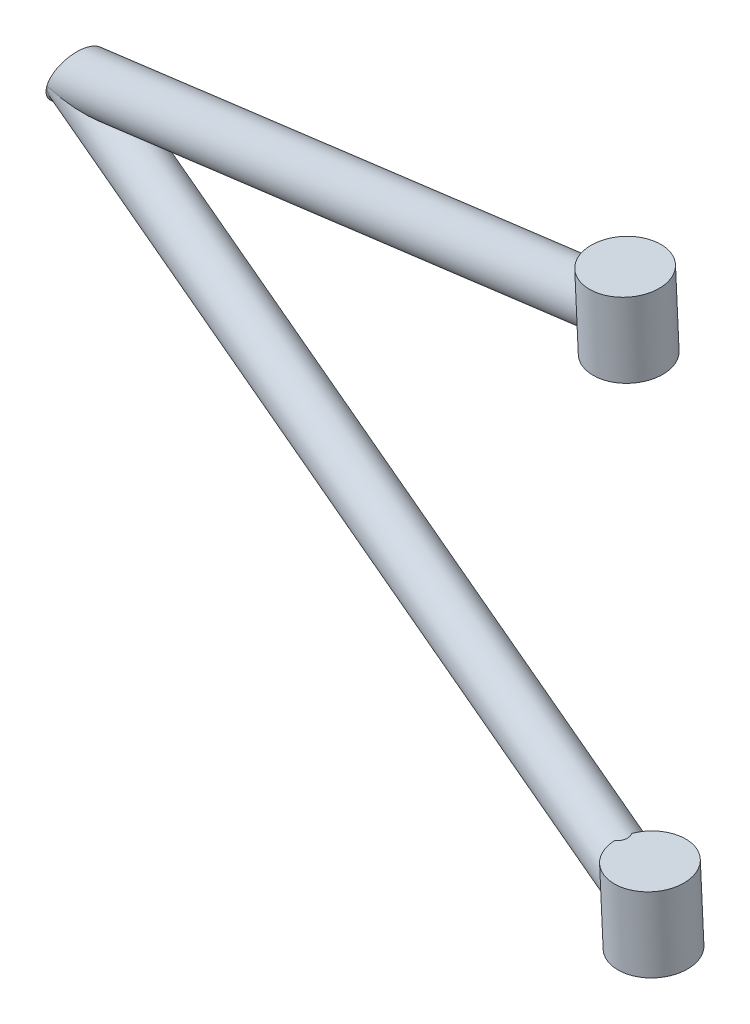
ISO-10303-21;
HEADER;
FILE_DESCRIPTION(('STEP AP214'),'2;1');
FILE_NAME('part.step','',(''),(''),'','','');
FILE_SCHEMA(('AUTOMOTIVE_DESIGN { 1 0 10303 214 1 1 1 1 }'));
ENDSEC;
DATA;
#1=APPLICATION_CONTEXT('core data for automotive mechanical design processes');
#2=APPLICATION_PROTOCOL_DEFINITION('international standard','automotive_design',2000,#1);
#3=PRODUCT_CONTEXT('',#1,'mechanical');
#4=PRODUCT('Part','Part','',(#3));
#5=PRODUCT_RELATED_PRODUCT_CATEGORY('part','',(#4));
#6=PRODUCT_DEFINITION_FORMATION('','',#4);
#7=PRODUCT_DEFINITION_CONTEXT('part definition',#1,'design');
#8=PRODUCT_DEFINITION('design','',#6,#7);
#9=PRODUCT_DEFINITION_SHAPE('','',#8);
#10=(LENGTH_UNIT() NAMED_UNIT(*) SI_UNIT(.MILLI.,.METRE.));
#11=(NAMED_UNIT(*) PLANE_ANGLE_UNIT() SI_UNIT($,.RADIAN.));
#12=(NAMED_UNIT(*) SI_UNIT($,.STERADIAN.) SOLID_ANGLE_UNIT());
#13=UNCERTAINTY_MEASURE_WITH_UNIT(LENGTH_MEASURE(1.E-05),#10,'distance_accuracy_value','');
#14=(GEOMETRIC_REPRESENTATION_CONTEXT(3) GLOBAL_UNCERTAINTY_ASSIGNED_CONTEXT((#13)) GLOBAL_UNIT_ASSIGNED_CONTEXT((#10,
#11,#12)) REPRESENTATION_CONTEXT('',''));
#15=CARTESIAN_POINT('',(0.,0.,0.));
#16=DIRECTION('',(0.,0.,1.));
#17=DIRECTION('',(1.,0.,0.));
#18=AXIS2_PLACEMENT_3D('',#15,#16,#17);
#19=CARTESIAN_POINT('',(-255.,-221.47,-254.503));
#20=DIRECTION('',(-0.912524270681738,0.366844617908996,-0.18089909266761));
#21=DIRECTION('',(-0.372998472957095,-0.927831956321658,0.));
#22=AXIS2_PLACEMENT_3D('',#19,#20,#21);
#23=CYLINDRICAL_SURFACE('',#22,9.525);
#24=CARTESIAN_POINT('',(-293.242179047782,-206.096230762816,-262.084141360994));
#25=DIRECTION('',(0.,0.998892249777093,0.0470560658710238));
#26=DIRECTION('',(-0.977268280554209,0.00997618647777122,-0.211771536156257));
#27=AXIS2_PLACEMENT_3D('',#24,#25,#26);
#28=ELLIPSE('',#27,26.6116574264944,9.525);
#29=CARTESIAN_POINT('',(-267.803485256219,-206.220132528784,-259.453991316177));
#30=VERTEX_POINT('',#29);
#31=CARTESIAN_POINT('',(-268.999181284131,-206.479491491884,-253.948395951266));
#32=VERTEX_POINT('',#31);
#33=EDGE_CURVE('E80',#30,#32,#28,.F.);
#34=ORIENTED_EDGE('',*,*,#33,.F.);
#35=CARTESIAN_POINT('',(-268.999181284131,-206.479491491884,-253.948395951266));
#36=CARTESIAN_POINT('',(-269.002027058384,-206.597281765921,-253.691307271021));
#37=CARTESIAN_POINT('',(-268.997422440891,-206.727582274235,-253.440362789745));
#38=CARTESIAN_POINT('',(-268.975269621373,-207.009720352981,-252.952253153281));
#39=CARTESIAN_POINT('',(-268.957753102969,-207.161504470911,-252.715055799051));
#40=CARTESIAN_POINT('',(-268.889261389808,-207.641032528117,-252.029920876135));
#41=CARTESIAN_POINT('',(-268.822316578556,-207.995888817091,-251.60233013466));
#42=CARTESIAN_POINT('',(-268.688358795682,-208.624830076123,-250.944160886033));
#43=CARTESIAN_POINT('',(-268.62951435236,-208.883915213699,-250.696886145662));
#44=CARTESIAN_POINT('',(-268.503196462785,-209.420986234165,-250.226017282439));
#45=CARTESIAN_POINT('',(-268.43572174143,-209.698974907154,-250.002426667797));
#46=CARTESIAN_POINT('',(-268.29493645003,-210.272917150471,-249.577361204792));
#47=CARTESIAN_POINT('',(-268.221589231369,-210.568980272668,-249.376047516785));
#48=CARTESIAN_POINT('',(-268.072647655781,-211.17537209919,-248.997219916914));
#49=CARTESIAN_POINT('',(-267.997053459267,-211.485699786018,-248.819704311051));
#50=CARTESIAN_POINT('',(-267.844893975632,-212.12747752915,-248.484567080196));
#51=CARTESIAN_POINT('',(-267.768354608773,-212.459267098073,-248.327583357675));
#52=CARTESIAN_POINT('',(-267.620051455921,-213.135360364199,-248.040212795102));
#53=CARTESIAN_POINT('',(-267.548288919906,-213.479667300725,-247.909832898311));
#54=CARTESIAN_POINT('',(-267.414077423232,-214.178139020874,-247.678325051182));
#55=CARTESIAN_POINT('',(-267.351590313371,-214.532255891144,-247.57707557895));
#56=CARTESIAN_POINT('',(-267.240372746688,-215.250128755127,-247.406364494216));
#57=CARTESIAN_POINT('',(-267.191631653116,-215.613877056226,-247.336878277124));
#58=CARTESIAN_POINT('',(-267.128646930773,-216.202946113072,-247.254400520731));
#59=CARTESIAN_POINT('',(-267.108385534404,-216.426048270673,-247.229933694902));
#60=CARTESIAN_POINT('',(-267.075911394003,-216.87391721482,-247.195311467648));
#61=CARTESIAN_POINT('',(-267.06369587303,-217.098683399934,-247.185151127128));
#62=CARTESIAN_POINT('',(-267.048335265385,-217.548471357907,-247.180289769268));
#63=CARTESIAN_POINT('',(-267.045179978434,-217.773492557791,-247.185571353417));
#64=CARTESIAN_POINT('',(-267.048669782723,-218.222500758791,-247.212623151361));
#65=CARTESIAN_POINT('',(-267.055314865061,-218.446487760847,-247.234393350179));
#66=CARTESIAN_POINT('',(-267.07884807896,-218.89338863569,-247.295495765692));
#67=CARTESIAN_POINT('',(-267.095818628274,-219.116279173646,-247.334968611185));
#68=CARTESIAN_POINT('',(-267.139872563679,-219.557090389539,-247.43195988936));
#69=CARTESIAN_POINT('',(-267.166955858159,-219.775011112481,-247.489478158567));
#70=CARTESIAN_POINT('',(-267.230439868918,-220.203962580154,-247.622543216837));
#71=CARTESIAN_POINT('',(-267.266843940386,-220.414990812895,-247.698096497276));
#72=CARTESIAN_POINT('',(-267.347618196681,-220.828334862453,-247.866705483164));
#73=CARTESIAN_POINT('',(-267.391988259384,-221.030650812776,-247.959760920293));
#74=CARTESIAN_POINT('',(-267.482448071842,-221.406482385751,-248.152846530102));
#75=CARTESIAN_POINT('',(-267.52797501819,-221.58090909257,-248.251376723042));
#76=CARTESIAN_POINT('',(-267.622725218573,-221.920901834783,-248.461253315904));
#77=CARTESIAN_POINT('',(-267.671949904864,-222.08646439383,-248.572604690881));
#78=CARTESIAN_POINT('',(-267.772625085065,-222.408216030898,-248.807202572484));
#79=CARTESIAN_POINT('',(-267.824075740608,-222.564404426262,-248.930449943712));
#80=CARTESIAN_POINT('',(-267.92778809184,-222.867161476253,-249.187939081873));
#81=CARTESIAN_POINT('',(-267.980049886566,-223.013728944601,-249.322182200032));
#82=CARTESIAN_POINT('',(-268.090626098118,-223.315039188903,-249.618405103689));
#83=CARTESIAN_POINT('',(-268.148869953667,-223.468471088136,-249.781745462371));
#84=CARTESIAN_POINT('',(-268.26293755966,-223.762892515341,-250.120060600185));
#85=CARTESIAN_POINT('',(-268.318761173744,-223.903881342714,-250.295036033453));
#86=CARTESIAN_POINT('',(-268.426437244984,-224.173461604852,-250.655577583678));
#87=CARTESIAN_POINT('',(-268.478287813328,-224.302047150452,-250.841148665605));
#88=CARTESIAN_POINT('',(-268.576576625746,-224.546723872333,-251.221722458414));
#89=CARTESIAN_POINT('',(-268.623014592875,-224.662814409261,-251.416725651183));
#90=CARTESIAN_POINT('',(-268.715936080794,-224.899573758123,-251.846170310311));
#91=CARTESIAN_POINT('',(-268.761298399741,-225.018135558351,-252.08202122415));
#92=CARTESIAN_POINT('',(-268.841388950985,-225.238341375559,-252.563257168879));
#93=CARTESIAN_POINT('',(-268.876116183664,-225.339983801835,-252.808643093547));
#94=CARTESIAN_POINT('',(-268.933471832033,-225.526134215741,-253.307247811301));
#95=CARTESIAN_POINT('',(-268.956098893357,-225.610640284651,-253.560467477859));
#96=CARTESIAN_POINT('',(-268.988030876522,-225.762237912657,-254.072890173458));
#97=CARTESIAN_POINT('',(-268.997336169749,-225.829329957184,-254.332093035493));
#98=CARTESIAN_POINT('',(-269.001696195754,-225.94639578002,-254.857091203281));
#99=CARTESIAN_POINT('',(-268.99661269584,-225.996198312909,-255.12292597175));
#100=CARTESIAN_POINT('',(-268.971216810513,-226.077536134189,-255.656668183566));
#101=CARTESIAN_POINT('',(-268.950904167836,-226.10907111397,-255.924575661851));
#102=CARTESIAN_POINT('',(-268.894702054331,-226.153693843135,-256.460220538388));
#103=CARTESIAN_POINT('',(-268.858817053428,-226.166786881558,-256.727957963383));
#104=CARTESIAN_POINT('',(-268.771456882729,-226.174472376756,-257.261139869286));
#105=CARTESIAN_POINT('',(-268.719982447356,-226.169065704933,-257.526584457605));
#106=CARTESIAN_POINT('',(-268.604829880745,-226.140562959445,-258.03943952601));
#107=CARTESIAN_POINT('',(-268.541917590735,-226.118393092558,-258.287074296626));
#108=CARTESIAN_POINT('',(-268.402942999876,-226.057612926214,-258.776559617301));
#109=CARTESIAN_POINT('',(-268.326881183952,-226.019003232942,-259.018410380288));
#110=CARTESIAN_POINT('',(-268.162438729957,-225.925587741907,-259.494654410705));
#111=CARTESIAN_POINT('',(-268.074058974807,-225.870783104644,-259.729048211155));
#112=CARTESIAN_POINT('',(-267.886036112298,-225.745288532338,-260.188891402374));
#113=CARTESIAN_POINT('',(-267.786392837061,-225.674598360513,-260.414340659761));
#114=CARTESIAN_POINT('',(-267.577265524763,-225.517804312336,-260.854633062445));
#115=CARTESIAN_POINT('',(-267.467795988483,-225.431722968676,-261.069491134385));
#116=CARTESIAN_POINT('',(-267.240339953389,-225.244446445466,-261.487798245459));
#117=CARTESIAN_POINT('',(-267.122353482928,-225.143251316232,-261.691247322572));
#118=CARTESIAN_POINT('',(-266.879411611677,-224.926041035129,-262.085859224807));
#119=CARTESIAN_POINT('',(-266.754452677016,-224.810018329012,-262.277015712043));
#120=CARTESIAN_POINT('',(-266.499391649497,-224.563497492675,-262.646106065254));
#121=CARTESIAN_POINT('',(-266.36928940199,-224.432998926981,-262.824039533174));
#122=CARTESIAN_POINT('',(-266.098961313591,-224.150540778938,-263.174963078257));
#123=CARTESIAN_POINT('',(-265.958562526261,-223.997814294263,-263.347203546462));
#124=CARTESIAN_POINT('',(-265.676684118047,-223.676783878469,-263.675574987865));
#125=CARTESIAN_POINT('',(-265.535204397941,-223.50847850117,-263.831704462639));
#126=CARTESIAN_POINT('',(-265.253968568908,-223.156491938778,-264.127179552213));
#127=CARTESIAN_POINT('',(-265.114212013242,-222.972814839329,-264.266529602946));
#128=CARTESIAN_POINT('',(-264.839468791914,-222.590210723141,-264.527901074147));
#129=CARTESIAN_POINT('',(-264.704481185994,-222.391286737306,-264.64992592498));
#130=CARTESIAN_POINT('',(-264.465526816704,-222.014497597785,-264.856377119861));
#131=CARTESIAN_POINT('',(-264.360256757068,-221.839013262592,-264.943648891374));
#132=CARTESIAN_POINT('',(-264.15736231258,-221.478165617132,-265.105738541364));
#133=CARTESIAN_POINT('',(-264.059736426078,-221.292804259229,-265.180558869117));
#134=CARTESIAN_POINT('',(-263.87437408173,-220.912964656416,-265.317435442801));
#135=CARTESIAN_POINT('',(-263.786625020899,-220.718498488797,-265.379508040432));
#136=CARTESIAN_POINT('',(-263.622959842622,-220.321083942582,-265.490863218166));
#137=CARTESIAN_POINT('',(-263.547043628743,-220.118135633129,-265.540145902504));
#138=CARTESIAN_POINT('',(-263.408528506179,-219.703835100483,-265.626152331143));
#139=CARTESIAN_POINT('',(-263.346005830121,-219.492442494194,-265.66280487087));
#140=CARTESIAN_POINT('',(-263.236277272517,-219.063930408956,-265.723356887658));
#141=CARTESIAN_POINT('',(-263.189071147856,-218.846811020966,-265.747256567144));
#142=CARTESIAN_POINT('',(-263.110806255877,-218.408655289587,-265.782712991704));
#143=CARTESIAN_POINT('',(-263.079750555972,-218.187618210356,-265.794267392505));
#144=CARTESIAN_POINT('',(-263.033931879105,-217.743582097351,-265.805627749328));
#145=CARTESIAN_POINT('',(-263.019168968806,-217.520583055553,-265.805433657279));
#146=CARTESIAN_POINT('',(-263.005950265585,-217.09206286448,-265.794481668705));
#147=CARTESIAN_POINT('',(-263.006297165886,-216.886554199515,-265.784560418599));
#148=CARTESIAN_POINT('',(-263.019551067483,-216.476526079242,-265.755980641297));
#149=CARTESIAN_POINT('',(-263.032462596494,-216.272007007239,-265.73731896571));
#150=CARTESIAN_POINT('',(-263.088547514609,-215.661416759414,-265.669099951292));
#151=CARTESIAN_POINT('',(-263.149068592571,-215.258189329703,-265.60730481187));
#152=CARTESIAN_POINT('',(-263.29428176386,-214.529335213786,-265.467348013958));
#153=CARTESIAN_POINT('',(-263.373483705904,-214.201702737599,-265.393447957483));
#154=CARTESIAN_POINT('',(-263.55279965705,-213.556926237932,-265.226848595537));
#155=CARTESIAN_POINT('',(-263.652926045861,-213.239788552819,-265.134138162074));
#156=CARTESIAN_POINT('',(-263.87007950305,-212.616032874436,-264.930329061104));
#157=CARTESIAN_POINT('',(-263.987169701014,-212.309459718312,-264.819161470459));
#158=CARTESIAN_POINT('',(-264.234236617331,-211.708892677373,-264.578879055059));
#159=CARTESIAN_POINT('',(-264.36421128217,-211.414896798661,-264.449767088948));
#160=CARTESIAN_POINT('',(-264.639599156271,-210.82826385451,-264.167489929058));
#161=CARTESIAN_POINT('',(-264.785430839137,-210.536198629456,-264.01354420514));
#162=CARTESIAN_POINT('',(-265.084676500241,-209.967913709799,-263.685033927689));
#163=CARTESIAN_POINT('',(-265.238091130409,-209.69169538203,-263.510467599541));
#164=CARTESIAN_POINT('',(-265.548743946872,-209.158633919375,-263.140711175994));
#165=CARTESIAN_POINT('',(-265.705953948938,-208.901685272908,-262.945649983384));
#166=CARTESIAN_POINT('',(-266.022310306382,-208.407975201705,-262.532730629854));
#167=CARTESIAN_POINT('',(-266.181456512893,-208.171212236041,-262.314874211901));
#168=CARTESIAN_POINT('',(-266.467977558257,-207.764983283899,-261.899536373176));
#169=CARTESIAN_POINT('',(-266.595545250988,-207.591357100887,-261.706261089943));
#170=CARTESIAN_POINT('',(-266.848091703795,-207.262105549216,-261.303602764138));
#171=CARTESIAN_POINT('',(-266.973072456049,-207.106465871146,-261.094232749884));
#172=CARTESIAN_POINT('',(-267.219910845411,-206.814249037155,-260.656435079789));
#173=CARTESIAN_POINT('',(-267.341716293618,-206.677910717974,-260.427816558191));
#174=CARTESIAN_POINT('',(-267.578479687007,-206.429643838718,-259.953499126584));
#175=CARTESIAN_POINT('',(-267.693418672708,-206.317780781797,-259.707756647516));
#176=CARTESIAN_POINT('',(-267.803485256219,-206.220132528784,-259.453991316177));
#177=B_SPLINE_CURVE_WITH_KNOTS('',3,(#35,#36,#37,#38,#39,#40,#41,#42,#43,#44,#45,#46,#47,#48,
#49,#50,#51,#52,#53,#54,#55,#56,#57,#58,#59,#60,#61,#62,#63,#64,#65,#66,#67,#68,#69,#70,#71,#72,
#73,#74,#75,#76,#77,#78,#79,#80,#81,#82,#83,#84,#85,#86,#87,#88,#89,#90,#91,#92,#93,#94,#95,#96,
#97,#98,#99,#100,#101,#102,#103,#104,#105,#106,#107,#108,#109,#110,#111,#112,#113,#114,#115,
#116,#117,#118,#119,#120,#121,#122,#123,#124,#125,#126,#127,#128,#129,#130,#131,#132,#133,#134,
#135,#136,#137,#138,#139,#140,#141,#142,#143,#144,#145,#146,#147,#148,#149,#150,#151,#152,#153,
#154,#155,#156,#157,#158,#159,#160,#161,#162,#163,#164,#165,#166,#167,#168,#169,#170,#171,#172,
#173,#174,#175,#176),.UNSPECIFIED.,.F.,.F.,(4,2,2,2,2,2,2,2,2,2,2,2,2,2,2,2,2,2,2,2,2,2,2,2,2,2,
2,2,2,2,2,2,2,2,2,2,2,2,2,2,2,2,2,2,2,2,2,2,2,2,2,2,2,2,2,2,2,2,2,2,2,2,2,2,2,2,2,2,2,2,4),(0.,
0.847248957157231,1.6924258005278,3.36276576404507,4.45048572585774,5.53836658145462,
6.63366380567451,7.72888302282516,8.8526026956397,9.97661527103461,11.0958685200097,
12.2142532928548,12.8897999019044,13.5651132316115,14.2396659749774,14.9142181056372,
15.5942264573468,16.2742286490016,16.9544759652559,17.6347128537402,18.2503947330978,
18.866316328309,19.4822827225455,20.0983249244539,20.7922888745158,21.4862918728685,
22.1806227833062,22.8749892047903,23.677589920424,24.4802660513894,25.2830320066975,
26.0857755818622,26.8962571907383,27.7067524913824,28.5170152994147,29.3272399417495,
30.0956997057351,30.8641311366938,31.6325075166233,32.4008953503882,33.1681673395534,
33.9354367744217,34.7030986823458,35.4707836899616,36.278760846051,37.0868130815582,
37.8946512231761,38.702329190311,39.3690957519279,40.0357310011374,40.701505731846,
41.3672750364111,42.0367385694379,42.7061914757576,43.3757714834112,44.0453542307181,
44.6619834053255,45.2788348670848,46.5121712393652,47.5460979811353,48.5806381743947,
49.6191322393971,50.6574610554911,51.7392464537713,52.8211250187362,53.8965658681629,
54.9719245473777,55.8393415741105,56.7060636942318,57.5827161452229,58.4616868366876),.UNSPECIFIED.);
#178=EDGE_CURVE('E86',#32,#30,#177,.T.);
#179=ORIENTED_EDGE('',*,*,#178,.F.);
#180=EDGE_LOOP('',(#34,#179));
#181=FACE_BOUND('',#180,.T.);
#182=CARTESIAN_POINT('',(-536.966082,-108.116588,-310.400043));
#183=DIRECTION('',(-0.977042799081254,0.0314302037809526,-0.210711914835768));
#184=DIRECTION('',(0.0209918277884314,0.998447490299481,0.0515941109116967));
#185=AXIS2_PLACEMENT_3D('',#182,#183,#184);
#186=ELLIPSE('',#185,10.1198136751925,9.525);
#187=CARTESIAN_POINT('',(-534.946721078445,-107.678567289377,-319.69821186949));
#188=VERTEX_POINT('',#187);
#189=CARTESIAN_POINT('',(-538.985442921555,-108.554608710622,-301.10187413051));
#190=VERTEX_POINT('',#189);
#191=EDGE_CURVE('E93',#188,#190,#186,.T.);
#192=ORIENTED_EDGE('',*,*,#191,.F.);
#193=CARTESIAN_POINT('',(-536.966082,-108.116588,-310.400043));
#194=DIRECTION('',(0.0209918277884314,0.998447490299481,0.0515941109116967));
#195=DIRECTION('',(-0.977042799081254,0.0314302037809526,-0.210711914835768));
#196=AXIS2_PLACEMENT_3D('',#193,#194,#195);
#197=ELLIPSE('',#196,28.1983093968675,9.525);
#198=EDGE_CURVE('E119',#190,#188,#197,.T.);
#199=ORIENTED_EDGE('',*,*,#198,.F.);
#200=EDGE_LOOP('',(#192,#199));
#201=FACE_BOUND('',#200,.T.);
#202=ADVANCED_FACE('F67',(#181,#201),#23,.T.);
#203=CARTESIAN_POINT('',(-255.,-14.5,-244.753));
#204=DIRECTION('',(-0.926705770492292,-0.307678965136663,-0.215754650815965));
#205=DIRECTION('',(0.31510033175296,-0.949058365396552,0.));
#206=AXIS2_PLACEMENT_3D('',#203,#204,#205);
#207=CYLINDRICAL_SURFACE('',#206,9.52500000000001);
#208=CARTESIAN_POINT('',(-268.633289940602,-29.0627020287556,-248.625854657224));
#209=CARTESIAN_POINT('',(-268.584086028301,-29.0463641347164,-248.836041616373));
#210=CARTESIAN_POINT('',(-268.530044270602,-29.0206333536843,-249.044385978099));
#211=CARTESIAN_POINT('',(-268.412989807852,-28.9508865839975,-249.455421376165));
#212=CARTESIAN_POINT('',(-268.349975780005,-28.9068678972901,-249.658111573624));
#213=CARTESIAN_POINT('',(-268.21585812356,-28.8014289556022,-250.05636505575));
#214=CARTESIAN_POINT('',(-268.144746706781,-28.7399918613072,-250.251921236074));
#215=CARTESIAN_POINT('',(-267.995575620283,-28.6009753706731,-250.634419012283));
#216=CARTESIAN_POINT('',(-267.917515931971,-28.5233959311373,-250.821360585112));
#217=CARTESIAN_POINT('',(-267.75635878948,-28.3543030272498,-251.184026826689));
#218=CARTESIAN_POINT('',(-267.673316309891,-28.2629291052564,-251.359841267887));
#219=CARTESIAN_POINT('',(-267.502612066784,-28.0671066909308,-251.701713186186));
#220=CARTESIAN_POINT('',(-267.414948244965,-27.9626523437256,-251.86776624482));
#221=CARTESIAN_POINT('',(-267.146620686153,-27.6317371414549,-252.35083604356));
#222=CARTESIAN_POINT('',(-266.960530411264,-27.3876286701508,-252.6529624405));
#223=CARTESIAN_POINT('',(-266.627320003945,-26.9257017422472,-253.149325544352));
#224=CARTESIAN_POINT('',(-266.481602693047,-26.7157008020514,-253.352026030612));
#225=CARTESIAN_POINT('',(-266.188825699668,-26.2773576557685,-253.735718227119));
#226=CARTESIAN_POINT('',(-266.041765425847,-26.0490069867723,-253.916699823541));
#227=CARTESIAN_POINT('',(-265.74852611952,-25.5761430000884,-254.258237117461));
#228=CARTESIAN_POINT('',(-265.602349672217,-25.3315958805321,-254.418747912196));
#229=CARTESIAN_POINT('',(-265.313495511257,-24.8287285290389,-254.719968858573));
#230=CARTESIAN_POINT('',(-265.170817337451,-24.5704101228606,-254.860681626025));
#231=CARTESIAN_POINT('',(-264.886840660347,-24.0330940267443,-255.127369461219));
#232=CARTESIAN_POINT('',(-264.745725601929,-23.7537019376482,-255.252744286514));
#233=CARTESIAN_POINT('',(-264.472279944798,-23.18282691912,-255.484201791188));
#234=CARTESIAN_POINT('',(-264.33995063863,-22.8913422208506,-255.590281635902));
#235=CARTESIAN_POINT('',(-264.087265867737,-22.2974890814647,-255.783415955801));
#236=CARTESIAN_POINT('',(-263.966897445483,-21.9951329123165,-255.870491144358));
#237=CARTESIAN_POINT('',(-263.741537342079,-21.3800331549798,-256.02571849576));
#238=CARTESIAN_POINT('',(-263.636540790867,-21.0672928953325,-256.093876657989));
#239=CARTESIAN_POINT('',(-263.47117609731,-20.5158748755179,-256.195373517952));
#240=CARTESIAN_POINT('',(-263.406333225874,-20.2793509160689,-256.233155299422));
#241=CARTESIAN_POINT('',(-263.289209266904,-19.8017014967485,-256.297745178885));
#242=CARTESIAN_POINT('',(-263.236927509761,-19.5605762829013,-256.324553861886));
#243=CARTESIAN_POINT('',(-263.147074724368,-19.0749624171903,-256.366584842205));
#244=CARTESIAN_POINT('',(-263.109480481926,-18.8304797103764,-256.381825459551));
#245=CARTESIAN_POINT('',(-263.050988686762,-18.3390506932535,-256.400062508754));
#246=CARTESIAN_POINT('',(-263.030087944891,-18.0921048626345,-256.403061279761));
#247=CARTESIAN_POINT('',(-263.008710177768,-17.6370341296197,-256.396575640378));
#248=CARTESIAN_POINT('',(-263.005503733835,-17.4290100015943,-256.389008988488));
#249=CARTESIAN_POINT('',(-263.013031735441,-17.013784382056,-256.364192637846));
#250=CARTESIAN_POINT('',(-263.023764697909,-16.806582805381,-256.346943969314));
#251=CARTESIAN_POINT('',(-263.059597667775,-16.3946225799866,-256.302364624489));
#252=CARTESIAN_POINT('',(-263.084689695101,-16.1898626387954,-256.275039551171));
#253=CARTESIAN_POINT('',(-263.149159357226,-15.7842687978499,-256.210005871656));
#254=CARTESIAN_POINT('',(-263.188537191411,-15.5834349529332,-256.172297120537));
#255=CARTESIAN_POINT('',(-263.280969559276,-15.1872024768976,-256.086328163922));
#256=CARTESIAN_POINT('',(-263.334027211133,-14.9918050962314,-256.03806555316));
#257=CARTESIAN_POINT('',(-263.452707864842,-14.6078510554504,-255.930977909516));
#258=CARTESIAN_POINT('',(-263.518331101063,-14.4192945230058,-255.872152679627));
#259=CARTESIAN_POINT('',(-263.660720656388,-14.0499867621878,-255.744001328991));
#260=CARTESIAN_POINT('',(-263.737494366746,-13.869240815102,-255.674668241625));
#261=CARTESIAN_POINT('',(-263.900504179974,-13.5164039858156,-255.525685686611));
#262=CARTESIAN_POINT('',(-263.986744049508,-13.3443165889352,-255.446032110064));
#263=CARTESIAN_POINT('',(-264.168907387819,-13.0056797005446,-255.274780913671));
#264=CARTESIAN_POINT('',(-264.265003035458,-12.8393372999053,-255.182957815457));
#265=CARTESIAN_POINT('',(-264.463429260811,-12.516584035995,-254.989016891664));
#266=CARTESIAN_POINT('',(-264.565762339328,-12.360177208252,-254.886894926027));
#267=CARTESIAN_POINT('',(-264.774894597889,-12.0575439832243,-254.6726454943));
#268=CARTESIAN_POINT('',(-264.881693861568,-11.9113177767226,-254.560517840795));
#269=CARTESIAN_POINT('',(-265.098154137466,-11.6291385031134,-254.326511205497));
#270=CARTESIAN_POINT('',(-265.207815445266,-11.4931865027821,-254.20463121381));
#271=CARTESIAN_POINT('',(-265.449620752729,-11.2066166188321,-253.927160577739));
#272=CARTESIAN_POINT('',(-265.58205486345,-11.0581639903196,-253.769579840337));
#273=CARTESIAN_POINT('',(-265.84659171714,-10.7760609572156,-253.441411798253));
#274=CARTESIAN_POINT('',(-265.978694426086,-10.6424120161953,-253.270823210356));
#275=CARTESIAN_POINT('',(-266.240554144771,-10.3900240381753,-252.917072861017));
#276=CARTESIAN_POINT('',(-266.370309882612,-10.2712928899112,-252.73390452575));
#277=CARTESIAN_POINT('',(-266.625487015144,-10.0490578627302,-252.355699580175));
#278=CARTESIAN_POINT('',(-266.750908440326,-9.94555387667469,-252.160663053384));
#279=CARTESIAN_POINT('',(-267.006191947193,-9.74581313554777,-251.742183564912));
#280=CARTESIAN_POINT('',(-267.135507914675,-9.65096745405022,-251.517740258213));
#281=CARTESIAN_POINT('',(-267.384877439038,-9.47998593350323,-251.05686978592));
#282=CARTESIAN_POINT('',(-267.504930387349,-9.40385132303605,-250.820441834635));
#283=CARTESIAN_POINT('',(-267.733858418275,-9.27074250016696,-250.337093780871));
#284=CARTESIAN_POINT('',(-267.84273685446,-9.21376252754046,-250.090176857864));
#285=CARTESIAN_POINT('',(-268.047704865098,-9.11931673908882,-249.587465562997));
#286=CARTESIAN_POINT('',(-268.143795321027,-9.08184957772441,-249.331671804553));
#287=CARTESIAN_POINT('',(-268.317521894239,-9.02804041837491,-248.825637844827));
#288=CARTESIAN_POINT('',(-268.39582478827,-9.01076624368509,-248.575725312251));
#289=CARTESIAN_POINT('',(-268.538691260073,-8.99427614176765,-248.071416607058));
#290=CARTESIAN_POINT('',(-268.603255221534,-8.99505971017295,-247.817020559868));
#291=CARTESIAN_POINT('',(-268.718004329359,-9.01467750291203,-247.305748531133));
#292=CARTESIAN_POINT('',(-268.768192316787,-9.03350815747358,-247.048873049975));
#293=CARTESIAN_POINT('',(-268.853889901902,-9.08906731410636,-246.534614917243));
#294=CARTESIAN_POINT('',(-268.889399795445,-9.12579545539693,-246.277232275996));
#295=CARTESIAN_POINT('',(-268.944526698235,-9.21489316458186,-245.775107651741));
#296=CARTESIAN_POINT('',(-268.964765069799,-9.26651692407522,-245.530300725023));
#297=CARTESIAN_POINT('',(-268.992085194035,-9.38554307255743,-245.043822786486));
#298=CARTESIAN_POINT('',(-268.999167417958,-9.45294489628129,-244.802151662651));
#299=CARTESIAN_POINT('',(-269.000693977867,-9.60312148290813,-244.323605956541));
#300=CARTESIAN_POINT('',(-268.995138442299,-9.68589608956061,-244.086731325542));
#301=CARTESIAN_POINT('',(-268.972135379438,-9.86638284553805,-243.619337889565));
#302=CARTESIAN_POINT('',(-268.954687429074,-9.96409552618665,-243.388819311007));
#303=CARTESIAN_POINT('',(-268.908099696575,-10.1774528518941,-242.928203289403));
#304=CARTESIAN_POINT('',(-268.87859649255,-10.2935791219431,-242.698365750315));
#305=CARTESIAN_POINT('',(-268.809178428811,-10.5408479373713,-242.248557633376));
#306=CARTESIAN_POINT('',(-268.769263348892,-10.6719908003103,-242.028587264326));
#307=CARTESIAN_POINT('',(-268.680440140509,-10.9490397137666,-241.599748668001));
#308=CARTESIAN_POINT('',(-268.631523403714,-11.0949598352719,-241.390891316746));
#309=CARTESIAN_POINT('',(-268.526391553726,-11.4011467478383,-240.985912013984));
#310=CARTESIAN_POINT('',(-268.470176222912,-11.561413966642,-240.789790442481));
#311=CARTESIAN_POINT('',(-268.348697983703,-11.9063664472436,-240.400049654002));
#312=CARTESIAN_POINT('',(-268.283091066704,-12.0919476954831,-240.207328654886));
#313=CARTESIAN_POINT('',(-268.148313626029,-12.4787809687173,-239.839593316262));
#314=CARTESIAN_POINT('',(-268.079142642843,-12.6800350160998,-239.664581268605));
#315=CARTESIAN_POINT('',(-267.940216363893,-13.0976156655573,-239.33440851727));
#316=CARTESIAN_POINT('',(-267.870461939847,-13.3139224309426,-239.179222424202));
#317=CARTESIAN_POINT('',(-267.733493752562,-13.7612714844457,-238.890510366599));
#318=CARTESIAN_POINT('',(-267.666279089534,-13.9923084744708,-238.756976674786));
#319=CARTESIAN_POINT('',(-267.55317762799,-14.4112091053646,-238.542721149341));
#320=CARTESIAN_POINT('',(-267.506033390918,-14.5961906738107,-238.45700542315));
#321=CARTESIAN_POINT('',(-267.416720376773,-14.9733810189929,-238.300155734981));
#322=CARTESIAN_POINT('',(-267.37455049017,-15.1655881714009,-238.229018518645));
#323=CARTESIAN_POINT('',(-267.296652222518,-15.5560174605102,-238.102109161587));
#324=CARTESIAN_POINT('',(-267.260915869425,-15.7542317924562,-238.046317959107));
#325=CARTESIAN_POINT('',(-267.197020790491,-16.1556354916131,-237.950454337632));
#326=CARTESIAN_POINT('',(-267.168862201864,-16.3588249488383,-237.910382203263));
#327=CARTESIAN_POINT('',(-267.120957405193,-16.7689248541138,-237.846066714283));
#328=CARTESIAN_POINT('',(-267.101221376837,-16.975839491639,-237.82184249507));
#329=CARTESIAN_POINT('',(-267.070649323241,-17.3915429924678,-237.789076879609));
#330=CARTESIAN_POINT('',(-267.059813144216,-17.6003318233233,-237.78053521237));
#331=CARTESIAN_POINT('',(-267.047028207801,-18.0183965674612,-237.77856644711));
#332=CARTESIAN_POINT('',(-267.045086349429,-18.227672732916,-237.785151076094));
#333=CARTESIAN_POINT('',(-267.049703169327,-18.645204155643,-237.812630054857));
#334=CARTESIAN_POINT('',(-267.056263976749,-18.8534591440924,-237.833527988215));
#335=CARTESIAN_POINT('',(-267.080505722325,-19.3332301146933,-237.897377321808));
#336=CARTESIAN_POINT('',(-267.101043835641,-19.6039572203556,-237.945208739646));
#337=CARTESIAN_POINT('',(-267.15360296849,-20.1397471312139,-238.061679708316));
#338=CARTESIAN_POINT('',(-267.185627823342,-20.4048080131505,-238.130326207929));
#339=CARTESIAN_POINT('',(-267.25900672118,-20.9286757539283,-238.286509589443));
#340=CARTESIAN_POINT('',(-267.300384256128,-21.1874650154652,-238.374094014962));
#341=CARTESIAN_POINT('',(-267.39022000121,-21.6973245061544,-238.566272878225));
#342=CARTESIAN_POINT('',(-267.43867837813,-21.9483945533155,-238.670867716649));
#343=CARTESIAN_POINT('',(-267.560124339819,-22.5367954702809,-238.938658972277));
#344=CARTESIAN_POINT('',(-267.635408870251,-22.8704241746155,-239.108974932037));
#345=CARTESIAN_POINT('',(-267.79080399882,-23.5211598803749,-239.476940191021));
#346=CARTESIAN_POINT('',(-267.870916668428,-23.838259679833,-239.674601270228));
#347=CARTESIAN_POINT('',(-268.031674606645,-24.4546576576584,-240.09569434323));
#348=CARTESIAN_POINT('',(-268.11231981361,-24.7539578576203,-240.319123401914));
#349=CARTESIAN_POINT('',(-268.270172727786,-25.3330540814112,-240.790930657263));
#350=CARTESIAN_POINT('',(-268.347381774518,-25.612857730085,-241.039299006676));
#351=CARTESIAN_POINT('',(-268.47710086947,-26.0870054873448,-241.499019394666));
#352=CARTESIAN_POINT('',(-268.531135243141,-26.2859166321349,-241.705244123044));
#353=CARTESIAN_POINT('',(-268.633169834266,-26.6695243505946,-242.131988046006));
#354=CARTESIAN_POINT('',(-268.681170040603,-26.8542208980765,-242.352507266924));
#355=CARTESIAN_POINT('',(-268.769164867862,-27.2071422481283,-242.80717806241));
#356=CARTESIAN_POINT('',(-268.80917545305,-27.3753995475287,-243.041301220559));
#357=CARTESIAN_POINT('',(-268.879333250333,-27.6935711675069,-243.523232339877));
#358=CARTESIAN_POINT('',(-268.909479922431,-27.8434844835673,-243.771041049392));
#359=CARTESIAN_POINT('',(-268.951612824859,-28.0863710803435,-244.21416854362));
#360=CARTESIAN_POINT('',(-268.966273973825,-28.1840849905609,-244.40664203686));
#361=CARTESIAN_POINT('',(-268.988122866185,-28.3665207627596,-244.798044021626));
#362=CARTESIAN_POINT('',(-268.995312597259,-28.4512460750811,-244.996970781809));
#363=CARTESIAN_POINT('',(-269.001385697769,-28.6063096785026,-245.400312536682));
#364=CARTESIAN_POINT('',(-269.000276085714,-28.6766600743262,-245.604722748427));
#365=CARTESIAN_POINT('',(-268.989014478281,-28.8017074335144,-246.018049364509));
#366=CARTESIAN_POINT('',(-268.978863635374,-28.8564063907711,-246.22696519121));
#367=CARTESIAN_POINT('',(-268.951021190236,-28.9424421911581,-246.618394502634));
#368=CARTESIAN_POINT('',(-268.934582336854,-28.9759761453223,-246.800515475142));
#369=CARTESIAN_POINT('',(-268.894323902462,-29.0299008861787,-247.165955467036));
#370=CARTESIAN_POINT('',(-268.870502284046,-29.0502880399874,-247.349274803444));
#371=CARTESIAN_POINT('',(-268.815391399638,-29.0774254149602,-247.715777941874));
#372=CARTESIAN_POINT('',(-268.784103406398,-29.0841779584873,-247.898961761664));
#373=CARTESIAN_POINT('',(-268.714158930388,-29.0838225108975,-248.263833720506));
#374=CARTESIAN_POINT('',(-268.675504999177,-29.0767193115615,-248.445522354821));
#375=CARTESIAN_POINT('',(-268.633289940602,-29.0627020287556,-248.625854657224));
#376=B_SPLINE_CURVE_WITH_KNOTS('',3,(#208,#209,#210,#211,#212,#213,#214,#215,#216,#217,#218,
#219,#220,#221,#222,#223,#224,#225,#226,#227,#228,#229,#230,#231,#232,#233,#234,#235,#236,#237,
#238,#239,#240,#241,#242,#243,#244,#245,#246,#247,#248,#249,#250,#251,#252,#253,#254,#255,#256,
#257,#258,#259,#260,#261,#262,#263,#264,#265,#266,#267,#268,#269,#270,#271,#272,#273,#274,#275,
#276,#277,#278,#279,#280,#281,#282,#283,#284,#285,#286,#287,#288,#289,#290,#291,#292,#293,#294,
#295,#296,#297,#298,#299,#300,#301,#302,#303,#304,#305,#306,#307,#308,#309,#310,#311,#312,#313,
#314,#315,#316,#317,#318,#319,#320,#321,#322,#323,#324,#325,#326,#327,#328,#329,#330,#331,#332,
#333,#334,#335,#336,#337,#338,#339,#340,#341,#342,#343,#344,#345,#346,#347,#348,#349,#350,#351,
#352,#353,#354,#355,#356,#357,#358,#359,#360,#361,#362,#363,#364,#365,#366,#367,#368,#369,#370,
#371,#372,#373,#374,#375),.UNSPECIFIED.,.T.,.F.,(4,2,2,2,2,2,2,2,2,2,2,2,2,2,2,2,2,2,2,2,2,2,2,
2,2,2,2,2,2,2,2,2,2,2,2,2,2,2,2,2,2,2,2,2,2,2,2,2,2,2,2,2,2,2,2,2,2,2,2,2,2,2,2,2,2,2,2,2,2,2,2,
2,2,2,2,2,2,2,2,2,2,2,2,4),(0.,0.649235713523042,1.29856724416911,1.94852867178946,
2.59849183872034,3.24227328694279,3.88634393236945,5.17377682303279,6.15128602211232,
7.1292486655584,8.10932086920717,9.0892634592066,10.0999239171864,11.1107327336391,
12.1204342957699,13.129815272299,13.8737256249481,14.6175963123428,15.3602864799593,
16.1028347290305,16.7267545106704,17.3506079163711,17.9741149508695,18.5976306879582,
19.2212886750531,19.8449582954395,20.4690432271443,21.0933773938826,21.7315403877554,
22.3699609482319,23.0083934693757,23.6468921884904,24.407460141316,25.1681032209389,
25.9291468611846,26.6901851464608,27.5166902149656,28.3432495378916,29.1695600732657,
29.995813621437,30.7821950815733,31.5685545774786,32.3547585610189,33.140946696778,
33.893106528447,34.6452394173581,35.3973646619339,36.1495166646401,36.9262466375997,
37.7029930393062,38.4804861447145,39.2580024379387,40.0834101700093,40.9089245881407,
41.7333710120703,42.5575225580941,43.1846597550982,43.8116568035194,44.4378714859496,
45.0640975067806,45.691078268945,46.3180481969761,46.9455043616958,47.5731176780944,
48.3989083255452,49.2249749540232,50.0531400111656,50.8813245784986,52.0260062679828,
53.1711826184779,54.3162286558678,55.4608243377556,56.3348673405783,57.208911953621,
58.0811922447866,58.9535202807079,59.6020369946499,60.2503811345299,60.898177050976,
61.5458904056292,62.1030433100513,62.6603501078314,63.2175619723579,63.7745811684849),.UNSPECIFIED.);
#377=CARTESIAN_POINT('',(-268.633289940602,-29.0627020287556,-248.625854657224));
#378=VERTEX_POINT('',#377);
#379=EDGE_CURVE('E12',#378,#378,#376,.T.);
#380=ORIENTED_EDGE('',*,*,#379,.F.);
#381=EDGE_LOOP('',(#380));
#382=FACE_BOUND('',#381,.T.);
#383=CARTESIAN_POINT('',(-536.966082,-108.116588,-310.400043));
#384=DIRECTION('',(-0.912524270681739,0.366844617908996,-0.18089909266761));
#385=DIRECTION('',(-0.349789570295045,-0.929144915987946,-0.119737135453293));
#386=AXIS2_PLACEMENT_3D('',#383,#384,#385);
#387=ELLIPSE('',#386,12.3412648453571,9.52500000000001);
#388=EDGE_CURVE('E112',#188,#190,#387,.F.);
#389=ORIENTED_EDGE('',*,*,#388,.T.);
#390=ORIENTED_EDGE('',*,*,#198,.T.);
#391=EDGE_LOOP('',(#389,#390));
#392=FACE_BOUND('',#391,.T.);
#393=ADVANCED_FACE('F139',(#382,#392),#207,.T.);
#394=EDGE_CURVE('E108',#190,#188,#387,.F.);
#395=ORIENTED_EDGE('',*,*,#394,.T.);
#396=ORIENTED_EDGE('',*,*,#191,.T.);
#397=EDGE_LOOP('',(#395,#396));
#398=FACE_BOUND('',#397,.T.);
#399=ADVANCED_FACE('F142',(#398),#207,.T.);
#400=CARTESIAN_POINT('',(-536.966082,-108.116588,-310.400043));
#401=DIRECTION('',(-0.912524270681739,0.366844617908996,-0.18089909266761));
#402=DIRECTION('',(-0.372998472957094,-0.927831956321658,0.));
#403=AXIS2_PLACEMENT_3D('',#400,#401,#402);
#404=PLANE('',#403);
#405=ORIENTED_EDGE('',*,*,#394,.F.);
#406=ORIENTED_EDGE('',*,*,#388,.F.);
#407=EDGE_LOOP('',(#405,#406));
#408=FACE_BOUND('',#407,.T.);
#409=ADVANCED_FACE('F69',(#408),#404,.T.);
#410=CARTESIAN_POINT('',(-255.,-236.453384,-255.208841));
#411=DIRECTION('',(0.,0.998892249777093,0.0470560658710238));
#412=DIRECTION('',(0.,-0.0470560658710238,0.998892249777093));
#413=AXIS2_PLACEMENT_3D('',#410,#411,#412);
#414=PLANE('',#413);
#415=CARTESIAN_POINT('',(-255.,-236.453384,-255.208841));
#416=DIRECTION('',(0.,0.998892249777093,0.0470560658710238));
#417=DIRECTION('',(0.,-0.0470560658710238,0.998892249777093));
#418=AXIS2_PLACEMENT_3D('',#415,#416,#417);
#419=CIRCLE('',#418,14.);
#420=CARTESIAN_POINT('',(-255.,-237.112168922194,-241.224349503121));
#421=VERTEX_POINT('',#420);
#422=EDGE_CURVE('E109',#421,#421,#419,.T.);
#423=ORIENTED_EDGE('',*,*,#422,.F.);
#424=EDGE_LOOP('',(#423));
#425=FACE_BOUND('',#424,.T.);
#426=ADVANCED_FACE('F135',(#425),#414,.F.);
#427=CARTESIAN_POINT('',(-255.,-206.486616,-253.797159));
#428=DIRECTION('',(0.,0.998892249777093,0.0470560658710238));
#429=DIRECTION('',(0.,-0.0470560658710238,0.998892249777093));
#430=AXIS2_PLACEMENT_3D('',#427,#428,#429);
#431=PLANE('',#430);
#432=CARTESIAN_POINT('',(-255.,-206.486616,-253.797159));
#433=DIRECTION('',(0.,0.998892249777093,0.0470560658710238));
#434=DIRECTION('',(0.,-0.0470560658710238,0.998892249777093));
#435=AXIS2_PLACEMENT_3D('',#432,#433,#434);
#436=CIRCLE('',#435,14.);
#437=EDGE_CURVE('E105',#32,#30,#436,.T.);
#438=ORIENTED_EDGE('',*,*,#437,.T.);
#439=ORIENTED_EDGE('',*,*,#33,.T.);
#440=EDGE_LOOP('',(#438,#439));
#441=FACE_BOUND('',#440,.T.);
#442=ADVANCED_FACE('F107',(#441),#431,.T.);
#443=CARTESIAN_POINT('',(-255.,-236.453384,-255.208841));
#444=DIRECTION('',(0.,0.998892249777092,0.0470560658710293));
#445=DIRECTION('',(0.,-0.0470560658710293,0.998892249777092));
#446=AXIS2_PLACEMENT_3D('',#443,#444,#445);
#447=CYLINDRICAL_SURFACE('',#446,14.);
#448=ORIENTED_EDGE('',*,*,#437,.F.);
#449=ORIENTED_EDGE('',*,*,#178,.T.);
#450=EDGE_LOOP('',(#448,#449));
#451=FACE_BOUND('',#450,.T.);
#452=ORIENTED_EDGE('',*,*,#422,.T.);
#453=EDGE_LOOP('',(#452));
#454=FACE_BOUND('',#453,.T.);
#455=ADVANCED_FACE('F103',(#451,#454),#447,.T.);
#456=CARTESIAN_POINT('',(-255.,-29.4833837,-245.458841));
#457=DIRECTION('',(0.,0.998892249734874,0.0470560667672377));
#458=DIRECTION('',(0.,-0.0470560667672377,0.998892249734874));
#459=AXIS2_PLACEMENT_3D('',#456,#457,#458);
#460=PLANE('',#459);
#461=CARTESIAN_POINT('',(-255.,-29.4833837,-245.458841));
#462=DIRECTION('',(0.,0.998892249734874,0.0470560667672377));
#463=DIRECTION('',(0.,-0.0470560667672377,0.998892249734874));
#464=AXIS2_PLACEMENT_3D('',#461,#462,#463);
#465=CIRCLE('',#464,14.);
#466=CARTESIAN_POINT('',(-255.,-30.1421686347413,-231.474349503712));
#467=VERTEX_POINT('',#466);
#468=EDGE_CURVE('E270',#467,#467,#465,.T.);
#469=ORIENTED_EDGE('',*,*,#468,.F.);
#470=EDGE_LOOP('',(#469));
#471=FACE_BOUND('',#470,.T.);
#472=ADVANCED_FACE('F131',(#471),#460,.F.);
#473=CARTESIAN_POINT('',(-255.,0.483383728000001,-244.047159));
#474=DIRECTION('',(0.,0.998892249734874,0.0470560667672377));
#475=DIRECTION('',(0.,-0.0470560667672377,0.998892249734874));
#476=AXIS2_PLACEMENT_3D('',#473,#474,#475);
#477=PLANE('',#476);
#478=CARTESIAN_POINT('',(-255.,0.483383728000001,-244.047159));
#479=DIRECTION('',(0.,0.998892249734874,0.0470560667672377));
#480=DIRECTION('',(0.,-0.0470560667672377,0.998892249734874));
#481=AXIS2_PLACEMENT_3D('',#478,#479,#480);
#482=CIRCLE('',#481,14.);
#483=CARTESIAN_POINT('',(-255.,-0.175401206741327,-230.062667503712));
#484=VERTEX_POINT('',#483);
#485=EDGE_CURVE('E115',#484,#484,#482,.T.);
#486=ORIENTED_EDGE('',*,*,#485,.T.);
#487=EDGE_LOOP('',(#486));
#488=FACE_BOUND('',#487,.T.);
#489=ADVANCED_FACE('F177',(#488),#477,.T.);
#490=CARTESIAN_POINT('',(-255.,-29.4833837,-245.458841));
#491=DIRECTION('',(0.,0.998892249734874,0.0470560667672367));
#492=DIRECTION('',(0.,-0.0470560667672367,0.998892249734874));
#493=AXIS2_PLACEMENT_3D('',#490,#491,#492);
#494=CYLINDRICAL_SURFACE('',#493,14.);
#495=ORIENTED_EDGE('',*,*,#379,.T.);
#496=EDGE_LOOP('',(#495));
#497=FACE_BOUND('',#496,.T.);
#498=ORIENTED_EDGE('',*,*,#485,.F.);
#499=EDGE_LOOP('',(#498));
#500=FACE_BOUND('',#499,.T.);
#501=ORIENTED_EDGE('',*,*,#468,.T.);
#502=EDGE_LOOP('',(#501));
#503=FACE_BOUND('',#502,.T.);
#504=ADVANCED_FACE('F138',(#497,#500,#503),#494,.T.);
#505=CLOSED_SHELL('',(#202,#393,#399,#409,#426,#442,#455,#472,#489,#504));
#506=MANIFOLD_SOLID_BREP('B2',#505);
#507=ADVANCED_BREP_SHAPE_REPRESENTATION('',(#18,#506),#14);
#508=SHAPE_DEFINITION_REPRESENTATION(#9,#507);
ENDSEC;
END-ISO-10303-21;
